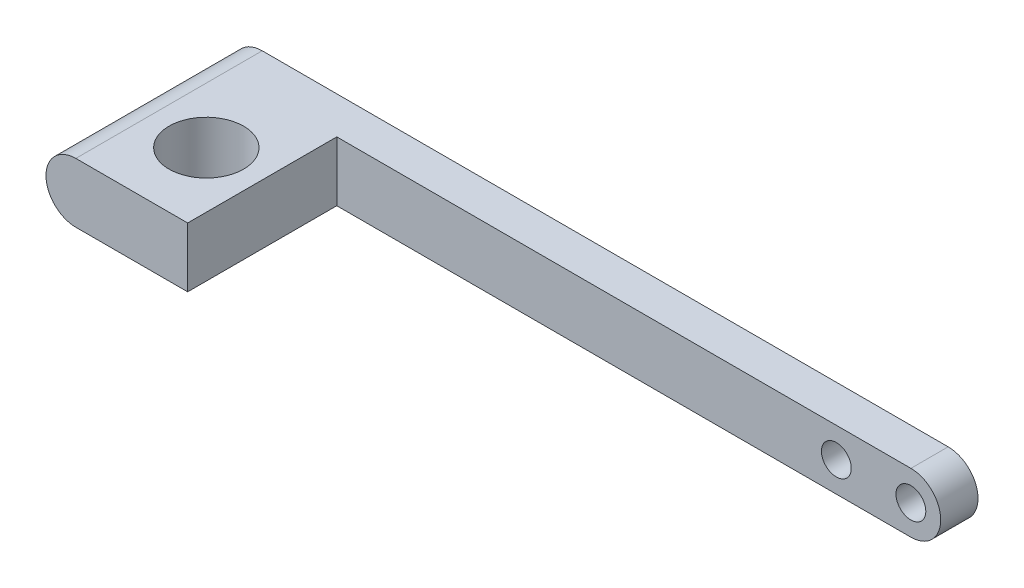
ISO-10303-21;
HEADER;
FILE_DESCRIPTION(('STEP AP214'),'2;1');
FILE_NAME('part.step','',(''),(''),'','','');
FILE_SCHEMA(('AUTOMOTIVE_DESIGN { 1 0 10303 214 1 1 1 1 }'));
ENDSEC;
DATA;
#1=APPLICATION_CONTEXT('core data for automotive mechanical design processes');
#2=APPLICATION_PROTOCOL_DEFINITION('international standard','automotive_design',2000,#1);
#3=PRODUCT_CONTEXT('',#1,'mechanical');
#4=PRODUCT('Part','Part','',(#3));
#5=PRODUCT_RELATED_PRODUCT_CATEGORY('part','',(#4));
#6=PRODUCT_DEFINITION_FORMATION('','',#4);
#7=PRODUCT_DEFINITION_CONTEXT('part definition',#1,'design');
#8=PRODUCT_DEFINITION('design','',#6,#7);
#9=PRODUCT_DEFINITION_SHAPE('','',#8);
#10=(LENGTH_UNIT() NAMED_UNIT(*) SI_UNIT(.MILLI.,.METRE.));
#11=(NAMED_UNIT(*) PLANE_ANGLE_UNIT() SI_UNIT($,.RADIAN.));
#12=(NAMED_UNIT(*) SI_UNIT($,.STERADIAN.) SOLID_ANGLE_UNIT());
#13=UNCERTAINTY_MEASURE_WITH_UNIT(LENGTH_MEASURE(1.E-05),#10,'distance_accuracy_value','');
#14=(GEOMETRIC_REPRESENTATION_CONTEXT(3) GLOBAL_UNCERTAINTY_ASSIGNED_CONTEXT((#13)) GLOBAL_UNIT_ASSIGNED_CONTEXT((#10,
#11,#12)) REPRESENTATION_CONTEXT('',''));
#15=CARTESIAN_POINT('',(0.,0.,0.));
#16=DIRECTION('',(0.,0.,1.));
#17=DIRECTION('',(1.,0.,0.));
#18=AXIS2_PLACEMENT_3D('',#15,#16,#17);
#19=CARTESIAN_POINT('',(-50.,8.,2.5));
#20=DIRECTION('',(0.,0.,-1.));
#21=DIRECTION('',(-1.,0.,0.));
#22=AXIS2_PLACEMENT_3D('',#19,#20,#21);
#23=PLANE('',#22);
#24=CARTESIAN_POINT('',(46.,4.,2.5));
#25=DIRECTION('',(0.,0.,1.));
#26=DIRECTION('',(1.,0.,0.));
#27=AXIS2_PLACEMENT_3D('',#24,#25,#26);
#28=CIRCLE('',#27,2.);
#29=CARTESIAN_POINT('',(48.,4.,2.5));
#30=VERTEX_POINT('',#29);
#31=EDGE_CURVE('E151',#30,#30,#28,.T.);
#32=ORIENTED_EDGE('',*,*,#31,.F.);
#33=EDGE_LOOP('',(#32));
#34=FACE_BOUND('',#33,.T.);
#35=CARTESIAN_POINT('',(36.,4.,2.5));
#36=DIRECTION('',(0.,0.,1.));
#37=DIRECTION('',(1.,0.,0.));
#38=AXIS2_PLACEMENT_3D('',#35,#36,#37);
#39=CIRCLE('',#38,2.);
#40=CARTESIAN_POINT('',(38.,4.,2.5));
#41=VERTEX_POINT('',#40);
#42=EDGE_CURVE('E147',#41,#41,#39,.T.);
#43=ORIENTED_EDGE('',*,*,#42,.F.);
#44=EDGE_LOOP('',(#43));
#45=FACE_BOUND('',#44,.T.);
#46=DIRECTION('',(0.,1.,0.));
#47=VECTOR('',#46,1.);
#48=CARTESIAN_POINT('',(-31.,0.,2.5));
#49=LINE('',#48,#47);
#50=CARTESIAN_POINT('',(-31.,0.,2.5));
#51=VERTEX_POINT('',#50);
#52=CARTESIAN_POINT('',(-31.,8.,2.5));
#53=VERTEX_POINT('',#52);
#54=EDGE_CURVE('E60',#51,#53,#49,.T.);
#55=ORIENTED_EDGE('',*,*,#54,.F.);
#56=DIRECTION('',(1.,0.,0.));
#57=VECTOR('',#56,1.);
#58=CARTESIAN_POINT('',(-50.,0.,2.5));
#59=LINE('',#58,#57);
#60=CARTESIAN_POINT('',(46.,0.,2.5));
#61=VERTEX_POINT('',#60);
#62=EDGE_CURVE('E64',#51,#61,#59,.T.);
#63=ORIENTED_EDGE('',*,*,#62,.T.);
#64=CARTESIAN_POINT('',(46.,4.,2.5));
#65=DIRECTION('',(0.,0.,1.));
#66=DIRECTION('',(1.,0.,0.));
#67=AXIS2_PLACEMENT_3D('',#64,#65,#66);
#68=CIRCLE('',#67,4.00000000000001);
#69=CARTESIAN_POINT('',(46.,8.,2.5));
#70=VERTEX_POINT('',#69);
#71=EDGE_CURVE('E139',#61,#70,#68,.T.);
#72=ORIENTED_EDGE('',*,*,#71,.T.);
#73=DIRECTION('',(1.,0.,0.));
#74=VECTOR('',#73,1.);
#75=CARTESIAN_POINT('',(-50.,8.,2.5));
#76=LINE('',#75,#74);
#77=EDGE_CURVE('E12',#53,#70,#76,.T.);
#78=ORIENTED_EDGE('',*,*,#77,.F.);
#79=EDGE_LOOP('',(#55,#63,#72,#78));
#80=FACE_BOUND('',#79,.T.);
#81=ADVANCED_FACE('F43',(#34,#45,#80),#23,.F.);
#82=CARTESIAN_POINT('',(-50.,8.,-2.5));
#83=DIRECTION('',(0.,0.,1.));
#84=DIRECTION('',(1.,0.,0.));
#85=AXIS2_PLACEMENT_3D('',#82,#83,#84);
#86=PLANE('',#85);
#87=CARTESIAN_POINT('',(36.,4.,-2.5));
#88=DIRECTION('',(0.,0.,1.));
#89=DIRECTION('',(1.,0.,0.));
#90=AXIS2_PLACEMENT_3D('',#87,#88,#89);
#91=CIRCLE('',#90,1.1);
#92=CARTESIAN_POINT('',(37.1,4.,-2.5));
#93=VERTEX_POINT('',#92);
#94=EDGE_CURVE('E159',#93,#93,#91,.T.);
#95=ORIENTED_EDGE('',*,*,#94,.T.);
#96=EDGE_LOOP('',(#95));
#97=FACE_BOUND('',#96,.T.);
#98=CARTESIAN_POINT('',(46.,4.,-2.5));
#99=DIRECTION('',(0.,0.,1.));
#100=DIRECTION('',(1.,0.,0.));
#101=AXIS2_PLACEMENT_3D('',#98,#99,#100);
#102=CIRCLE('',#101,1.1);
#103=CARTESIAN_POINT('',(47.1,4.,-2.5));
#104=VERTEX_POINT('',#103);
#105=EDGE_CURVE('E163',#104,#104,#102,.T.);
#106=ORIENTED_EDGE('',*,*,#105,.T.);
#107=EDGE_LOOP('',(#106));
#108=FACE_BOUND('',#107,.T.);
#109=DIRECTION('',(-1.,0.,0.));
#110=VECTOR('',#109,1.);
#111=CARTESIAN_POINT('',(-50.,0.,-2.5));
#112=LINE('',#111,#110);
#113=CARTESIAN_POINT('',(46.,0.,-2.5));
#114=VERTEX_POINT('',#113);
#115=CARTESIAN_POINT('',(-46.,0.,-2.5));
#116=VERTEX_POINT('',#115);
#117=EDGE_CURVE('E162',#114,#116,#112,.T.);
#118=ORIENTED_EDGE('',*,*,#117,.T.);
#119=CARTESIAN_POINT('',(-46.,4.,-2.5));
#120=DIRECTION('',(0.,0.,1.));
#121=DIRECTION('',(1.,0.,0.));
#122=AXIS2_PLACEMENT_3D('',#119,#120,#121);
#123=CIRCLE('',#122,4.00000000000001);
#124=CARTESIAN_POINT('',(-46.,8.,-2.5));
#125=VERTEX_POINT('',#124);
#126=EDGE_CURVE('E102',#125,#116,#123,.T.);
#127=ORIENTED_EDGE('',*,*,#126,.F.);
#128=DIRECTION('',(-1.,0.,0.));
#129=VECTOR('',#128,1.);
#130=CARTESIAN_POINT('',(-50.,8.,-2.5));
#131=LINE('',#130,#129);
#132=CARTESIAN_POINT('',(46.,8.,-2.5));
#133=VERTEX_POINT('',#132);
#134=EDGE_CURVE('E52',#133,#125,#131,.T.);
#135=ORIENTED_EDGE('',*,*,#134,.F.);
#136=CARTESIAN_POINT('',(46.,4.,-2.5));
#137=DIRECTION('',(0.,0.,1.));
#138=DIRECTION('',(1.,0.,0.));
#139=AXIS2_PLACEMENT_3D('',#136,#137,#138);
#140=CIRCLE('',#139,4.00000000000001);
#141=EDGE_CURVE('E140',#114,#133,#140,.T.);
#142=ORIENTED_EDGE('',*,*,#141,.F.);
#143=EDGE_LOOP('',(#118,#127,#135,#142));
#144=FACE_BOUND('',#143,.T.);
#145=ADVANCED_FACE('F45',(#97,#108,#144),#86,.F.);
#146=CARTESIAN_POINT('',(0.,8.,0.));
#147=DIRECTION('',(0.,-1.,0.));
#148=DIRECTION('',(0.,0.,-1.));
#149=AXIS2_PLACEMENT_3D('',#146,#147,#148);
#150=PLANE('',#149);
#151=CARTESIAN_POINT('',(-38.5,8.00000000000001,12.5));
#152=DIRECTION('',(0.,-1.,0.));
#153=DIRECTION('',(0.,0.,-1.));
#154=AXIS2_PLACEMENT_3D('',#151,#152,#153);
#155=CIRCLE('',#154,5.);
#156=CARTESIAN_POINT('',(-38.5,8.00000000000001,7.5));
#157=VERTEX_POINT('',#156);
#158=EDGE_CURVE('E121',#157,#157,#155,.T.);
#159=ORIENTED_EDGE('',*,*,#158,.T.);
#160=EDGE_LOOP('',(#159));
#161=FACE_BOUND('',#160,.T.);
#162=ORIENTED_EDGE('',*,*,#134,.T.);
#163=DIRECTION('',(0.,0.,1.));
#164=VECTOR('',#163,1.);
#165=CARTESIAN_POINT('',(-46.,8.,-2.5));
#166=LINE('',#165,#164);
#167=CARTESIAN_POINT('',(-46.,8.,22.5));
#168=VERTEX_POINT('',#167);
#169=EDGE_CURVE('E134',#125,#168,#166,.T.);
#170=ORIENTED_EDGE('',*,*,#169,.T.);
#171=DIRECTION('',(-1.,0.,0.));
#172=VECTOR('',#171,1.);
#173=CARTESIAN_POINT('',(0.,8.,22.5));
#174=LINE('',#173,#172);
#175=CARTESIAN_POINT('',(-31.,8.,22.5));
#176=VERTEX_POINT('',#175);
#177=EDGE_CURVE('E119',#176,#168,#174,.T.);
#178=ORIENTED_EDGE('',*,*,#177,.F.);
#179=DIRECTION('',(0.,0.,-1.));
#180=VECTOR('',#179,1.);
#181=CARTESIAN_POINT('',(-31.,8.,22.5));
#182=LINE('',#181,#180);
#183=EDGE_CURVE('E128',#176,#53,#182,.T.);
#184=ORIENTED_EDGE('',*,*,#183,.T.);
#185=ORIENTED_EDGE('',*,*,#77,.T.);
#186=DIRECTION('',(0.,0.,1.));
#187=VECTOR('',#186,1.);
#188=CARTESIAN_POINT('',(46.,8.,-2.5));
#189=LINE('',#188,#187);
#190=EDGE_CURVE('E136',#133,#70,#189,.T.);
#191=ORIENTED_EDGE('',*,*,#190,.F.);
#192=EDGE_LOOP('',(#162,#170,#178,#184,#185,#191));
#193=FACE_BOUND('',#192,.T.);
#194=ADVANCED_FACE('F189',(#161,#193),#150,.F.);
#195=CARTESIAN_POINT('',(0.,0.,0.));
#196=DIRECTION('',(0.,-1.,0.));
#197=DIRECTION('',(0.,0.,-1.));
#198=AXIS2_PLACEMENT_3D('',#195,#196,#197);
#199=PLANE('',#198);
#200=CARTESIAN_POINT('',(-38.5,0.,12.5));
#201=DIRECTION('',(0.,-1.,0.));
#202=DIRECTION('',(0.,0.,-1.));
#203=AXIS2_PLACEMENT_3D('',#200,#201,#202);
#204=CIRCLE('',#203,5.);
#205=CARTESIAN_POINT('',(-38.5,0.,7.5));
#206=VERTEX_POINT('',#205);
#207=EDGE_CURVE('E124',#206,#206,#204,.T.);
#208=ORIENTED_EDGE('',*,*,#207,.F.);
#209=EDGE_LOOP('',(#208));
#210=FACE_BOUND('',#209,.T.);
#211=DIRECTION('',(0.,0.,1.));
#212=VECTOR('',#211,1.);
#213=CARTESIAN_POINT('',(-46.,0.,-2.5));
#214=LINE('',#213,#212);
#215=CARTESIAN_POINT('',(-46.,0.,22.5));
#216=VERTEX_POINT('',#215);
#217=EDGE_CURVE('E96',#116,#216,#214,.T.);
#218=ORIENTED_EDGE('',*,*,#217,.F.);
#219=ORIENTED_EDGE('',*,*,#117,.F.);
#220=DIRECTION('',(0.,0.,1.));
#221=VECTOR('',#220,1.);
#222=CARTESIAN_POINT('',(46.,0.,-2.5));
#223=LINE('',#222,#221);
#224=EDGE_CURVE('E142',#114,#61,#223,.T.);
#225=ORIENTED_EDGE('',*,*,#224,.T.);
#226=ORIENTED_EDGE('',*,*,#62,.F.);
#227=DIRECTION('',(0.,0.,-1.));
#228=VECTOR('',#227,1.);
#229=CARTESIAN_POINT('',(-31.,0.,22.5));
#230=LINE('',#229,#228);
#231=CARTESIAN_POINT('',(-31.,0.,22.5));
#232=VERTEX_POINT('',#231);
#233=EDGE_CURVE('E106',#232,#51,#230,.T.);
#234=ORIENTED_EDGE('',*,*,#233,.F.);
#235=DIRECTION('',(1.,0.,0.));
#236=VECTOR('',#235,1.);
#237=CARTESIAN_POINT('',(0.,0.,22.5));
#238=LINE('',#237,#236);
#239=EDGE_CURVE('E109',#216,#232,#238,.T.);
#240=ORIENTED_EDGE('',*,*,#239,.F.);
#241=EDGE_LOOP('',(#218,#219,#225,#226,#234,#240));
#242=FACE_BOUND('',#241,.T.);
#243=ADVANCED_FACE('F110',(#210,#242),#199,.T.);
#244=CARTESIAN_POINT('',(46.,4.,-2.5));
#245=DIRECTION('',(0.,0.,1.));
#246=DIRECTION('',(1.,0.,0.));
#247=AXIS2_PLACEMENT_3D('',#244,#245,#246);
#248=CYLINDRICAL_SURFACE('',#247,1.1);
#249=ORIENTED_EDGE('',*,*,#105,.F.);
#250=EDGE_LOOP('',(#249));
#251=FACE_BOUND('',#250,.T.);
#252=CARTESIAN_POINT('',(46.,4.,-0.5));
#253=DIRECTION('',(0.,0.,1.));
#254=DIRECTION('',(1.,0.,0.));
#255=AXIS2_PLACEMENT_3D('',#252,#253,#254);
#256=CIRCLE('',#255,1.1);
#257=CARTESIAN_POINT('',(47.1,4.,-0.5));
#258=VERTEX_POINT('',#257);
#259=EDGE_CURVE('E47',#258,#258,#256,.F.);
#260=ORIENTED_EDGE('',*,*,#259,.F.);
#261=EDGE_LOOP('',(#260));
#262=FACE_BOUND('',#261,.T.);
#263=ADVANCED_FACE('F177',(#251,#262),#248,.F.);
#264=CARTESIAN_POINT('',(36.,4.,-2.5));
#265=DIRECTION('',(0.,0.,1.));
#266=DIRECTION('',(1.,0.,0.));
#267=AXIS2_PLACEMENT_3D('',#264,#265,#266);
#268=CYLINDRICAL_SURFACE('',#267,1.1);
#269=ORIENTED_EDGE('',*,*,#94,.F.);
#270=EDGE_LOOP('',(#269));
#271=FACE_BOUND('',#270,.T.);
#272=CARTESIAN_POINT('',(36.,4.,-0.5));
#273=DIRECTION('',(0.,0.,1.));
#274=DIRECTION('',(1.,0.,0.));
#275=AXIS2_PLACEMENT_3D('',#272,#273,#274);
#276=CIRCLE('',#275,1.1);
#277=CARTESIAN_POINT('',(37.1,4.,-0.5));
#278=VERTEX_POINT('',#277);
#279=EDGE_CURVE('E154',#278,#278,#276,.F.);
#280=ORIENTED_EDGE('',*,*,#279,.F.);
#281=EDGE_LOOP('',(#280));
#282=FACE_BOUND('',#281,.T.);
#283=ADVANCED_FACE('F179',(#271,#282),#268,.F.);
#284=CARTESIAN_POINT('',(-50.,8.,-0.5));
#285=DIRECTION('',(0.,0.,1.));
#286=DIRECTION('',(1.,0.,0.));
#287=AXIS2_PLACEMENT_3D('',#284,#285,#286);
#288=PLANE('',#287);
#289=CARTESIAN_POINT('',(36.,4.,-0.5));
#290=DIRECTION('',(0.,0.,1.));
#291=DIRECTION('',(1.,0.,0.));
#292=AXIS2_PLACEMENT_3D('',#289,#290,#291);
#293=CIRCLE('',#292,2.);
#294=CARTESIAN_POINT('',(38.,4.,-0.5));
#295=VERTEX_POINT('',#294);
#296=EDGE_CURVE('E150',#295,#295,#293,.F.);
#297=ORIENTED_EDGE('',*,*,#296,.F.);
#298=EDGE_LOOP('',(#297));
#299=FACE_BOUND('',#298,.T.);
#300=ORIENTED_EDGE('',*,*,#279,.T.);
#301=EDGE_LOOP('',(#300));
#302=FACE_BOUND('',#301,.T.);
#303=ADVANCED_FACE('F186',(#299,#302),#288,.T.);
#304=CARTESIAN_POINT('',(36.,4.,-8.15685424949239));
#305=DIRECTION('',(0.,0.,1.));
#306=DIRECTION('',(1.,0.,0.));
#307=AXIS2_PLACEMENT_3D('',#304,#305,#306);
#308=CYLINDRICAL_SURFACE('',#307,2.);
#309=ORIENTED_EDGE('',*,*,#296,.T.);
#310=EDGE_LOOP('',(#309));
#311=FACE_BOUND('',#310,.T.);
#312=ORIENTED_EDGE('',*,*,#42,.T.);
#313=EDGE_LOOP('',(#312));
#314=FACE_BOUND('',#313,.T.);
#315=ADVANCED_FACE('F234',(#311,#314),#308,.F.);
#316=CARTESIAN_POINT('',(-50.,8.,-0.5));
#317=DIRECTION('',(0.,0.,1.));
#318=DIRECTION('',(1.,0.,0.));
#319=AXIS2_PLACEMENT_3D('',#316,#317,#318);
#320=PLANE('',#319);
#321=CARTESIAN_POINT('',(46.,4.,-0.5));
#322=DIRECTION('',(0.,0.,1.));
#323=DIRECTION('',(1.,0.,0.));
#324=AXIS2_PLACEMENT_3D('',#321,#322,#323);
#325=CIRCLE('',#324,2.);
#326=CARTESIAN_POINT('',(48.,4.,-0.5));
#327=VERTEX_POINT('',#326);
#328=EDGE_CURVE('E146',#327,#327,#325,.F.);
#329=ORIENTED_EDGE('',*,*,#328,.F.);
#330=EDGE_LOOP('',(#329));
#331=FACE_BOUND('',#330,.T.);
#332=ORIENTED_EDGE('',*,*,#259,.T.);
#333=EDGE_LOOP('',(#332));
#334=FACE_BOUND('',#333,.T.);
#335=ADVANCED_FACE('F175',(#331,#334),#320,.T.);
#336=CARTESIAN_POINT('',(46.,4.,-8.15685424949239));
#337=DIRECTION('',(0.,0.,1.));
#338=DIRECTION('',(1.,0.,0.));
#339=AXIS2_PLACEMENT_3D('',#336,#337,#338);
#340=CYLINDRICAL_SURFACE('',#339,2.);
#341=ORIENTED_EDGE('',*,*,#328,.T.);
#342=EDGE_LOOP('',(#341));
#343=FACE_BOUND('',#342,.T.);
#344=ORIENTED_EDGE('',*,*,#31,.T.);
#345=EDGE_LOOP('',(#344));
#346=FACE_BOUND('',#345,.T.);
#347=ADVANCED_FACE('F231',(#343,#346),#340,.F.);
#348=CARTESIAN_POINT('',(46.,4.,-2.5));
#349=DIRECTION('',(0.,0.,1.));
#350=DIRECTION('',(1.,0.,0.));
#351=AXIS2_PLACEMENT_3D('',#348,#349,#350);
#352=CYLINDRICAL_SURFACE('',#351,4.00000000000001);
#353=ORIENTED_EDGE('',*,*,#71,.F.);
#354=ORIENTED_EDGE('',*,*,#224,.F.);
#355=ORIENTED_EDGE('',*,*,#141,.T.);
#356=ORIENTED_EDGE('',*,*,#190,.T.);
#357=EDGE_LOOP('',(#353,#354,#355,#356));
#358=FACE_BOUND('',#357,.T.);
#359=ADVANCED_FACE('F214',(#358),#352,.T.);
#360=CARTESIAN_POINT('',(-46.,4.,-2.5));
#361=DIRECTION('',(0.,0.,1.));
#362=DIRECTION('',(1.,0.,0.));
#363=AXIS2_PLACEMENT_3D('',#360,#361,#362);
#364=CYLINDRICAL_SURFACE('',#363,4.00000000000001);
#365=ORIENTED_EDGE('',*,*,#217,.T.);
#366=CARTESIAN_POINT('',(-46.,4.,22.5));
#367=DIRECTION('',(0.,0.,1.));
#368=DIRECTION('',(1.,0.,0.));
#369=AXIS2_PLACEMENT_3D('',#366,#367,#368);
#370=CIRCLE('',#369,4.00000000000001);
#371=EDGE_CURVE('E100',#168,#216,#370,.T.);
#372=ORIENTED_EDGE('',*,*,#371,.F.);
#373=ORIENTED_EDGE('',*,*,#169,.F.);
#374=ORIENTED_EDGE('',*,*,#126,.T.);
#375=EDGE_LOOP('',(#365,#372,#373,#374));
#376=FACE_BOUND('',#375,.T.);
#377=ADVANCED_FACE('F98',(#376),#364,.T.);
#378=CARTESIAN_POINT('',(-31.,0.,22.5));
#379=DIRECTION('',(-1.,0.,0.));
#380=DIRECTION('',(0.,0.,1.));
#381=AXIS2_PLACEMENT_3D('',#378,#379,#380);
#382=PLANE('',#381);
#383=ORIENTED_EDGE('',*,*,#54,.T.);
#384=ORIENTED_EDGE('',*,*,#183,.F.);
#385=DIRECTION('',(0.,1.,0.));
#386=VECTOR('',#385,1.);
#387=CARTESIAN_POINT('',(-31.,0.,22.5));
#388=LINE('',#387,#386);
#389=EDGE_CURVE('E114',#232,#176,#388,.T.);
#390=ORIENTED_EDGE('',*,*,#389,.F.);
#391=ORIENTED_EDGE('',*,*,#233,.T.);
#392=EDGE_LOOP('',(#383,#384,#390,#391));
#393=FACE_BOUND('',#392,.T.);
#394=ADVANCED_FACE('F217',(#393),#382,.F.);
#395=CARTESIAN_POINT('',(0.,0.,22.5));
#396=DIRECTION('',(0.,0.,1.));
#397=DIRECTION('',(1.,0.,0.));
#398=AXIS2_PLACEMENT_3D('',#395,#396,#397);
#399=PLANE('',#398);
#400=ORIENTED_EDGE('',*,*,#371,.T.);
#401=ORIENTED_EDGE('',*,*,#239,.T.);
#402=ORIENTED_EDGE('',*,*,#389,.T.);
#403=ORIENTED_EDGE('',*,*,#177,.T.);
#404=EDGE_LOOP('',(#400,#401,#402,#403));
#405=FACE_BOUND('',#404,.T.);
#406=ADVANCED_FACE('F117',(#405),#399,.T.);
#407=CARTESIAN_POINT('',(-38.5,8.00000000000001,12.5));
#408=DIRECTION('',(0.,-1.,0.));
#409=DIRECTION('',(0.,0.,-1.));
#410=AXIS2_PLACEMENT_3D('',#407,#408,#409);
#411=CYLINDRICAL_SURFACE('',#410,5.);
#412=ORIENTED_EDGE('',*,*,#158,.F.);
#413=EDGE_LOOP('',(#412));
#414=FACE_BOUND('',#413,.T.);
#415=ORIENTED_EDGE('',*,*,#207,.T.);
#416=EDGE_LOOP('',(#415));
#417=FACE_BOUND('',#416,.T.);
#418=ADVANCED_FACE('F224',(#414,#417),#411,.F.);
#419=CLOSED_SHELL('',(#81,#145,#194,#243,#263,#283,#303,#315,#335,#347,#359,#377,#394,#406,#418));
#420=MANIFOLD_SOLID_BREP('B2',#419);
#421=ADVANCED_BREP_SHAPE_REPRESENTATION('',(#18,#420),#14);
#422=SHAPE_DEFINITION_REPRESENTATION(#9,#421);
ENDSEC;
END-ISO-10303-21;
